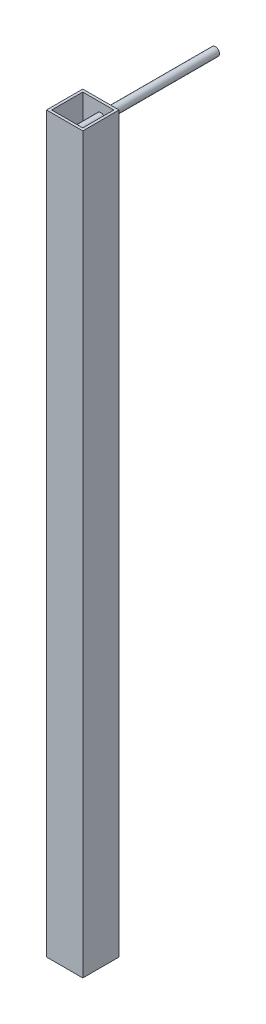
ISO-10303-21;
HEADER;
FILE_DESCRIPTION(('STEP AP214'),'2;1');
FILE_NAME('part.step','',(''),(''),'','','');
FILE_SCHEMA(('AUTOMOTIVE_DESIGN { 1 0 10303 214 1 1 1 1 }'));
ENDSEC;
DATA;
#1=APPLICATION_CONTEXT('core data for automotive mechanical design processes');
#2=APPLICATION_PROTOCOL_DEFINITION('international standard','automotive_design',2000,#1);
#3=PRODUCT_CONTEXT('',#1,'mechanical');
#4=PRODUCT('Part','Part','',(#3));
#5=PRODUCT_RELATED_PRODUCT_CATEGORY('part','',(#4));
#6=PRODUCT_DEFINITION_FORMATION('','',#4);
#7=PRODUCT_DEFINITION_CONTEXT('part definition',#1,'design');
#8=PRODUCT_DEFINITION('design','',#6,#7);
#9=PRODUCT_DEFINITION_SHAPE('','',#8);
#10=(LENGTH_UNIT() NAMED_UNIT(*) SI_UNIT(.MILLI.,.METRE.));
#11=(NAMED_UNIT(*) PLANE_ANGLE_UNIT() SI_UNIT($,.RADIAN.));
#12=(NAMED_UNIT(*) SI_UNIT($,.STERADIAN.) SOLID_ANGLE_UNIT());
#13=UNCERTAINTY_MEASURE_WITH_UNIT(LENGTH_MEASURE(1.E-05),#10,'distance_accuracy_value','');
#14=(GEOMETRIC_REPRESENTATION_CONTEXT(3) GLOBAL_UNCERTAINTY_ASSIGNED_CONTEXT((#13)) GLOBAL_UNIT_ASSIGNED_CONTEXT((#10,
#11,#12)) REPRESENTATION_CONTEXT('',''));
#15=CARTESIAN_POINT('',(0.,0.,0.));
#16=DIRECTION('',(0.,0.,1.));
#17=DIRECTION('',(1.,0.,0.));
#18=AXIS2_PLACEMENT_3D('',#15,#16,#17);
#19=CARTESIAN_POINT('',(-17.5,708.,-17.5));
#20=DIRECTION('',(0.,0.,1.));
#21=DIRECTION('',(1.,0.,0.));
#22=AXIS2_PLACEMENT_3D('',#19,#20,#21);
#23=PLANE('',#22);
#24=DIRECTION('',(-1.,0.,0.));
#25=VECTOR('',#24,1.);
#26=CARTESIAN_POINT('',(-17.5,0.,-17.5));
#27=LINE('',#26,#25);
#28=CARTESIAN_POINT('',(17.5,0.,-17.5));
#29=VERTEX_POINT('',#28);
#30=CARTESIAN_POINT('',(-17.5,0.,-17.5));
#31=VERTEX_POINT('',#30);
#32=EDGE_CURVE('E142',#29,#31,#27,.T.);
#33=ORIENTED_EDGE('',*,*,#32,.T.);
#34=DIRECTION('',(0.,-1.,0.));
#35=VECTOR('',#34,1.);
#36=CARTESIAN_POINT('',(-17.5,708.,-17.5));
#37=LINE('',#36,#35);
#38=CARTESIAN_POINT('',(-17.5,708.,-17.5));
#39=VERTEX_POINT('',#38);
#40=EDGE_CURVE('E148',#39,#31,#37,.T.);
#41=ORIENTED_EDGE('',*,*,#40,.F.);
#42=DIRECTION('',(-1.,0.,0.));
#43=VECTOR('',#42,1.);
#44=CARTESIAN_POINT('',(-17.5,708.,-17.5));
#45=LINE('',#44,#43);
#46=CARTESIAN_POINT('',(17.5,708.,-17.5));
#47=VERTEX_POINT('',#46);
#48=EDGE_CURVE('E146',#47,#39,#45,.T.);
#49=ORIENTED_EDGE('',*,*,#48,.F.);
#50=DIRECTION('',(0.,-1.,0.));
#51=VECTOR('',#50,1.);
#52=CARTESIAN_POINT('',(17.5,708.,-17.5));
#53=LINE('',#52,#51);
#54=EDGE_CURVE('E158',#47,#29,#53,.T.);
#55=ORIENTED_EDGE('',*,*,#54,.T.);
#56=EDGE_LOOP('',(#33,#41,#49,#55));
#57=FACE_BOUND('',#56,.T.);
#58=CARTESIAN_POINT('',(2.46862709967635,695.477178336874,-17.5));
#59=DIRECTION('',(0.,0.,1.));
#60=DIRECTION('',(1.,0.,0.));
#61=AXIS2_PLACEMENT_3D('',#58,#59,#60);
#62=CIRCLE('',#61,4.00000000000002);
#63=CARTESIAN_POINT('',(6.46862709967637,695.477178336874,-17.5));
#64=VERTEX_POINT('',#63);
#65=EDGE_CURVE('E11',#64,#64,#62,.F.);
#66=ORIENTED_EDGE('',*,*,#65,.F.);
#67=EDGE_LOOP('',(#66));
#68=FACE_BOUND('',#67,.T.);
#69=ADVANCED_FACE('F33',(#57,#68),#23,.F.);
#70=CARTESIAN_POINT('',(-15.,708.,-15.));
#71=DIRECTION('',(0.,0.,1.));
#72=DIRECTION('',(1.,0.,0.));
#73=AXIS2_PLACEMENT_3D('',#70,#71,#72);
#74=PLANE('',#73);
#75=DIRECTION('',(-1.,0.,0.));
#76=VECTOR('',#75,1.);
#77=CARTESIAN_POINT('',(-15.,0.,-15.));
#78=LINE('',#77,#76);
#79=CARTESIAN_POINT('',(15.,0.,-15.));
#80=VERTEX_POINT('',#79);
#81=CARTESIAN_POINT('',(-15.,0.,-15.));
#82=VERTEX_POINT('',#81);
#83=EDGE_CURVE('E115',#80,#82,#78,.T.);
#84=ORIENTED_EDGE('',*,*,#83,.F.);
#85=DIRECTION('',(0.,-1.,0.));
#86=VECTOR('',#85,1.);
#87=CARTESIAN_POINT('',(15.,708.,-15.));
#88=LINE('',#87,#86);
#89=CARTESIAN_POINT('',(15.,708.,-15.));
#90=VERTEX_POINT('',#89);
#91=EDGE_CURVE('E102',#90,#80,#88,.T.);
#92=ORIENTED_EDGE('',*,*,#91,.F.);
#93=DIRECTION('',(-1.,0.,0.));
#94=VECTOR('',#93,1.);
#95=CARTESIAN_POINT('',(-15.,708.,-15.));
#96=LINE('',#95,#94);
#97=CARTESIAN_POINT('',(-15.,708.,-15.));
#98=VERTEX_POINT('',#97);
#99=EDGE_CURVE('E107',#90,#98,#96,.T.);
#100=ORIENTED_EDGE('',*,*,#99,.T.);
#101=DIRECTION('',(0.,-1.,0.));
#102=VECTOR('',#101,1.);
#103=CARTESIAN_POINT('',(-15.,708.,-15.));
#104=LINE('',#103,#102);
#105=EDGE_CURVE('E117',#98,#82,#104,.T.);
#106=ORIENTED_EDGE('',*,*,#105,.T.);
#107=EDGE_LOOP('',(#84,#92,#100,#106));
#108=FACE_BOUND('',#107,.T.);
#109=CARTESIAN_POINT('',(2.46862709967635,695.477178336874,-15.));
#110=DIRECTION('',(0.,0.,1.));
#111=DIRECTION('',(1.,0.,0.));
#112=AXIS2_PLACEMENT_3D('',#109,#110,#111);
#113=CIRCLE('',#112,4.00000000000002);
#114=CARTESIAN_POINT('',(6.46862709967637,695.477178336874,-15.));
#115=VERTEX_POINT('',#114);
#116=EDGE_CURVE('E128',#115,#115,#113,.F.);
#117=ORIENTED_EDGE('',*,*,#116,.T.);
#118=EDGE_LOOP('',(#117));
#119=FACE_BOUND('',#118,.T.);
#120=ADVANCED_FACE('F111',(#108,#119),#74,.T.);
#121=CARTESIAN_POINT('',(-15.,708.,15.));
#122=DIRECTION('',(0.,0.,-1.));
#123=DIRECTION('',(-1.,0.,0.));
#124=AXIS2_PLACEMENT_3D('',#121,#122,#123);
#125=PLANE('',#124);
#126=DIRECTION('',(1.,0.,0.));
#127=VECTOR('',#126,1.);
#128=CARTESIAN_POINT('',(-15.,0.,15.));
#129=LINE('',#128,#127);
#130=CARTESIAN_POINT('',(-15.,0.,15.));
#131=VERTEX_POINT('',#130);
#132=CARTESIAN_POINT('',(15.,0.,15.));
#133=VERTEX_POINT('',#132);
#134=EDGE_CURVE('E108',#131,#133,#129,.T.);
#135=ORIENTED_EDGE('',*,*,#134,.F.);
#136=DIRECTION('',(0.,-1.,0.));
#137=VECTOR('',#136,1.);
#138=CARTESIAN_POINT('',(-15.,708.,15.));
#139=LINE('',#138,#137);
#140=CARTESIAN_POINT('',(-15.,708.,15.));
#141=VERTEX_POINT('',#140);
#142=EDGE_CURVE('E49',#141,#131,#139,.T.);
#143=ORIENTED_EDGE('',*,*,#142,.F.);
#144=DIRECTION('',(1.,0.,0.));
#145=VECTOR('',#144,1.);
#146=CARTESIAN_POINT('',(-15.,708.,15.));
#147=LINE('',#146,#145);
#148=CARTESIAN_POINT('',(15.,708.,15.));
#149=VERTEX_POINT('',#148);
#150=EDGE_CURVE('E123',#141,#149,#147,.T.);
#151=ORIENTED_EDGE('',*,*,#150,.T.);
#152=DIRECTION('',(0.,-1.,0.));
#153=VECTOR('',#152,1.);
#154=CARTESIAN_POINT('',(15.,708.,15.));
#155=LINE('',#154,#153);
#156=EDGE_CURVE('E103',#149,#133,#155,.T.);
#157=ORIENTED_EDGE('',*,*,#156,.T.);
#158=EDGE_LOOP('',(#135,#143,#151,#157));
#159=FACE_BOUND('',#158,.T.);
#160=CARTESIAN_POINT('',(2.46862709967635,695.477178336874,15.));
#161=DIRECTION('',(0.,0.,-1.));
#162=DIRECTION('',(-1.,0.,0.));
#163=AXIS2_PLACEMENT_3D('',#160,#161,#162);
#164=CIRCLE('',#163,4.00000000000002);
#165=CARTESIAN_POINT('',(-1.53137290032366,695.477178336874,15.));
#166=VERTEX_POINT('',#165);
#167=EDGE_CURVE('E295',#166,#166,#164,.T.);
#168=ORIENTED_EDGE('',*,*,#167,.F.);
#169=EDGE_LOOP('',(#168));
#170=FACE_BOUND('',#169,.T.);
#171=ADVANCED_FACE('F185',(#159,#170),#125,.T.);
#172=CARTESIAN_POINT('',(0.,708.,0.));
#173=DIRECTION('',(0.,1.,0.));
#174=DIRECTION('',(0.,0.,1.));
#175=AXIS2_PLACEMENT_3D('',#172,#173,#174);
#176=PLANE('',#175);
#177=DIRECTION('',(0.,0.,1.));
#178=VECTOR('',#177,1.);
#179=CARTESIAN_POINT('',(-17.5,708.,-17.5));
#180=LINE('',#179,#178);
#181=CARTESIAN_POINT('',(-17.5,708.,17.5));
#182=VERTEX_POINT('',#181);
#183=EDGE_CURVE('E138',#39,#182,#180,.T.);
#184=ORIENTED_EDGE('',*,*,#183,.T.);
#185=DIRECTION('',(1.,0.,0.));
#186=VECTOR('',#185,1.);
#187=CARTESIAN_POINT('',(-17.5,708.,17.5));
#188=LINE('',#187,#186);
#189=CARTESIAN_POINT('',(17.5,708.,17.5));
#190=VERTEX_POINT('',#189);
#191=EDGE_CURVE('E141',#182,#190,#188,.T.);
#192=ORIENTED_EDGE('',*,*,#191,.T.);
#193=DIRECTION('',(0.,0.,-1.));
#194=VECTOR('',#193,1.);
#195=CARTESIAN_POINT('',(17.5,708.,-17.5));
#196=LINE('',#195,#194);
#197=EDGE_CURVE('E144',#190,#47,#196,.T.);
#198=ORIENTED_EDGE('',*,*,#197,.T.);
#199=ORIENTED_EDGE('',*,*,#48,.T.);
#200=EDGE_LOOP('',(#184,#192,#198,#199));
#201=FACE_BOUND('',#200,.T.);
#202=ORIENTED_EDGE('',*,*,#99,.F.);
#203=DIRECTION('',(0.,0.,-1.));
#204=VECTOR('',#203,1.);
#205=CARTESIAN_POINT('',(15.,708.,-15.));
#206=LINE('',#205,#204);
#207=EDGE_CURVE('E99',#149,#90,#206,.T.);
#208=ORIENTED_EDGE('',*,*,#207,.F.);
#209=ORIENTED_EDGE('',*,*,#150,.F.);
#210=DIRECTION('',(0.,0.,1.));
#211=VECTOR('',#210,1.);
#212=CARTESIAN_POINT('',(-15.,708.,-15.));
#213=LINE('',#212,#211);
#214=EDGE_CURVE('E121',#98,#141,#213,.T.);
#215=ORIENTED_EDGE('',*,*,#214,.F.);
#216=EDGE_LOOP('',(#202,#208,#209,#215));
#217=FACE_BOUND('',#216,.T.);
#218=ADVANCED_FACE('F120',(#201,#217),#176,.T.);
#219=CARTESIAN_POINT('',(0.,0.,0.));
#220=DIRECTION('',(0.,1.,0.));
#221=DIRECTION('',(0.,0.,1.));
#222=AXIS2_PLACEMENT_3D('',#219,#220,#221);
#223=PLANE('',#222);
#224=DIRECTION('',(0.,0.,1.));
#225=VECTOR('',#224,1.);
#226=CARTESIAN_POINT('',(-17.5,0.,-17.5));
#227=LINE('',#226,#225);
#228=CARTESIAN_POINT('',(-17.5,0.,17.5));
#229=VERTEX_POINT('',#228);
#230=EDGE_CURVE('E116',#31,#229,#227,.T.);
#231=ORIENTED_EDGE('',*,*,#230,.F.);
#232=ORIENTED_EDGE('',*,*,#32,.F.);
#233=DIRECTION('',(0.,0.,-1.));
#234=VECTOR('',#233,1.);
#235=CARTESIAN_POINT('',(17.5,0.,-17.5));
#236=LINE('',#235,#234);
#237=CARTESIAN_POINT('',(17.5,0.,17.5));
#238=VERTEX_POINT('',#237);
#239=EDGE_CURVE('E153',#238,#29,#236,.T.);
#240=ORIENTED_EDGE('',*,*,#239,.F.);
#241=DIRECTION('',(1.,0.,0.));
#242=VECTOR('',#241,1.);
#243=CARTESIAN_POINT('',(-17.5,0.,17.5));
#244=LINE('',#243,#242);
#245=EDGE_CURVE('E151',#229,#238,#244,.T.);
#246=ORIENTED_EDGE('',*,*,#245,.F.);
#247=EDGE_LOOP('',(#231,#232,#240,#246));
#248=FACE_BOUND('',#247,.T.);
#249=DIRECTION('',(0.,0.,-1.));
#250=VECTOR('',#249,1.);
#251=CARTESIAN_POINT('',(15.,0.,-15.));
#252=LINE('',#251,#250);
#253=EDGE_CURVE('E57',#133,#80,#252,.T.);
#254=ORIENTED_EDGE('',*,*,#253,.T.);
#255=ORIENTED_EDGE('',*,*,#83,.T.);
#256=DIRECTION('',(0.,0.,1.));
#257=VECTOR('',#256,1.);
#258=CARTESIAN_POINT('',(-15.,0.,-15.));
#259=LINE('',#258,#257);
#260=EDGE_CURVE('E130',#82,#131,#259,.T.);
#261=ORIENTED_EDGE('',*,*,#260,.T.);
#262=ORIENTED_EDGE('',*,*,#134,.T.);
#263=EDGE_LOOP('',(#254,#255,#261,#262));
#264=FACE_BOUND('',#263,.T.);
#265=ADVANCED_FACE('F176',(#248,#264),#223,.F.);
#266=CARTESIAN_POINT('',(-17.5,708.,-17.5));
#267=DIRECTION('',(1.,0.,0.));
#268=DIRECTION('',(0.,0.,-1.));
#269=AXIS2_PLACEMENT_3D('',#266,#267,#268);
#270=PLANE('',#269);
#271=ORIENTED_EDGE('',*,*,#230,.T.);
#272=DIRECTION('',(0.,-1.,0.));
#273=VECTOR('',#272,1.);
#274=CARTESIAN_POINT('',(-17.5,708.,17.5));
#275=LINE('',#274,#273);
#276=EDGE_CURVE('E37',#182,#229,#275,.T.);
#277=ORIENTED_EDGE('',*,*,#276,.F.);
#278=ORIENTED_EDGE('',*,*,#183,.F.);
#279=ORIENTED_EDGE('',*,*,#40,.T.);
#280=EDGE_LOOP('',(#271,#277,#278,#279));
#281=FACE_BOUND('',#280,.T.);
#282=ADVANCED_FACE('F35',(#281),#270,.F.);
#283=CARTESIAN_POINT('',(-17.5,708.,17.5));
#284=DIRECTION('',(0.,0.,-1.));
#285=DIRECTION('',(-1.,0.,0.));
#286=AXIS2_PLACEMENT_3D('',#283,#284,#285);
#287=PLANE('',#286);
#288=ORIENTED_EDGE('',*,*,#245,.T.);
#289=DIRECTION('',(0.,-1.,0.));
#290=VECTOR('',#289,1.);
#291=CARTESIAN_POINT('',(17.5,708.,17.5));
#292=LINE('',#291,#290);
#293=EDGE_CURVE('E160',#190,#238,#292,.T.);
#294=ORIENTED_EDGE('',*,*,#293,.F.);
#295=ORIENTED_EDGE('',*,*,#191,.F.);
#296=ORIENTED_EDGE('',*,*,#276,.T.);
#297=EDGE_LOOP('',(#288,#294,#295,#296));
#298=FACE_BOUND('',#297,.T.);
#299=ADVANCED_FACE('F169',(#298),#287,.F.);
#300=CARTESIAN_POINT('',(17.5,708.,-17.5));
#301=DIRECTION('',(-1.,0.,0.));
#302=DIRECTION('',(0.,0.,1.));
#303=AXIS2_PLACEMENT_3D('',#300,#301,#302);
#304=PLANE('',#303);
#305=ORIENTED_EDGE('',*,*,#239,.T.);
#306=ORIENTED_EDGE('',*,*,#54,.F.);
#307=ORIENTED_EDGE('',*,*,#197,.F.);
#308=ORIENTED_EDGE('',*,*,#293,.T.);
#309=EDGE_LOOP('',(#305,#306,#307,#308));
#310=FACE_BOUND('',#309,.T.);
#311=ADVANCED_FACE('F179',(#310),#304,.F.);
#312=CARTESIAN_POINT('',(15.,708.,-15.));
#313=DIRECTION('',(-1.,0.,0.));
#314=DIRECTION('',(0.,0.,1.));
#315=AXIS2_PLACEMENT_3D('',#312,#313,#314);
#316=PLANE('',#315);
#317=ORIENTED_EDGE('',*,*,#253,.F.);
#318=ORIENTED_EDGE('',*,*,#156,.F.);
#319=ORIENTED_EDGE('',*,*,#207,.T.);
#320=ORIENTED_EDGE('',*,*,#91,.T.);
#321=EDGE_LOOP('',(#317,#318,#319,#320));
#322=FACE_BOUND('',#321,.T.);
#323=ADVANCED_FACE('F101',(#322),#316,.T.);
#324=CARTESIAN_POINT('',(-15.,708.,-15.));
#325=DIRECTION('',(1.,0.,0.));
#326=DIRECTION('',(0.,0.,-1.));
#327=AXIS2_PLACEMENT_3D('',#324,#325,#326);
#328=PLANE('',#327);
#329=ORIENTED_EDGE('',*,*,#260,.F.);
#330=ORIENTED_EDGE('',*,*,#105,.F.);
#331=ORIENTED_EDGE('',*,*,#214,.T.);
#332=ORIENTED_EDGE('',*,*,#142,.T.);
#333=EDGE_LOOP('',(#329,#330,#331,#332));
#334=FACE_BOUND('',#333,.T.);
#335=ADVANCED_FACE('F237',(#334),#328,.T.);
#336=CARTESIAN_POINT('',(2.46862709967635,695.477178336874,-125.5));
#337=DIRECTION('',(0.,0.,1.));
#338=DIRECTION('',(1.,0.,0.));
#339=AXIS2_PLACEMENT_3D('',#336,#337,#338);
#340=CYLINDRICAL_SURFACE('',#339,4.00000000000002);
#341=ORIENTED_EDGE('',*,*,#116,.F.);
#342=EDGE_LOOP('',(#341));
#343=FACE_BOUND('',#342,.T.);
#344=ORIENTED_EDGE('',*,*,#167,.T.);
#345=EDGE_LOOP('',(#344));
#346=FACE_BOUND('',#345,.T.);
#347=ADVANCED_FACE('F244',(#343,#346),#340,.T.);
#348=CARTESIAN_POINT('',(2.46862709967635,695.477178336874,-125.5));
#349=DIRECTION('',(0.,0.,-1.));
#350=DIRECTION('',(-1.,0.,0.));
#351=AXIS2_PLACEMENT_3D('',#348,#349,#350);
#352=CIRCLE('',#351,4.00000000000002);
#353=CARTESIAN_POINT('',(-1.53137290032366,695.477178336874,-125.5));
#354=VERTEX_POINT('',#353);
#355=EDGE_CURVE('E294',#354,#354,#352,.T.);
#356=ORIENTED_EDGE('',*,*,#355,.F.);
#357=EDGE_LOOP('',(#356));
#358=FACE_BOUND('',#357,.T.);
#359=ORIENTED_EDGE('',*,*,#65,.T.);
#360=EDGE_LOOP('',(#359));
#361=FACE_BOUND('',#360,.T.);
#362=ADVANCED_FACE('F267',(#358,#361),#340,.T.);
#363=CARTESIAN_POINT('',(2.46862709967635,695.477178336874,-125.5));
#364=DIRECTION('',(0.,0.,-1.));
#365=DIRECTION('',(-1.,0.,0.));
#366=AXIS2_PLACEMENT_3D('',#363,#364,#365);
#367=PLANE('',#366);
#368=ORIENTED_EDGE('',*,*,#355,.T.);
#369=EDGE_LOOP('',(#368));
#370=FACE_BOUND('',#369,.T.);
#371=ADVANCED_FACE('F276',(#370),#367,.T.);
#372=CLOSED_SHELL('',(#69,#120,#171,#218,#265,#282,#299,#311,#323,#335,#347,#362,#371));
#373=MANIFOLD_SOLID_BREP('B2',#372);
#374=ADVANCED_BREP_SHAPE_REPRESENTATION('',(#18,#373),#14);
#375=SHAPE_DEFINITION_REPRESENTATION(#9,#374);
ENDSEC;
END-ISO-10303-21;
